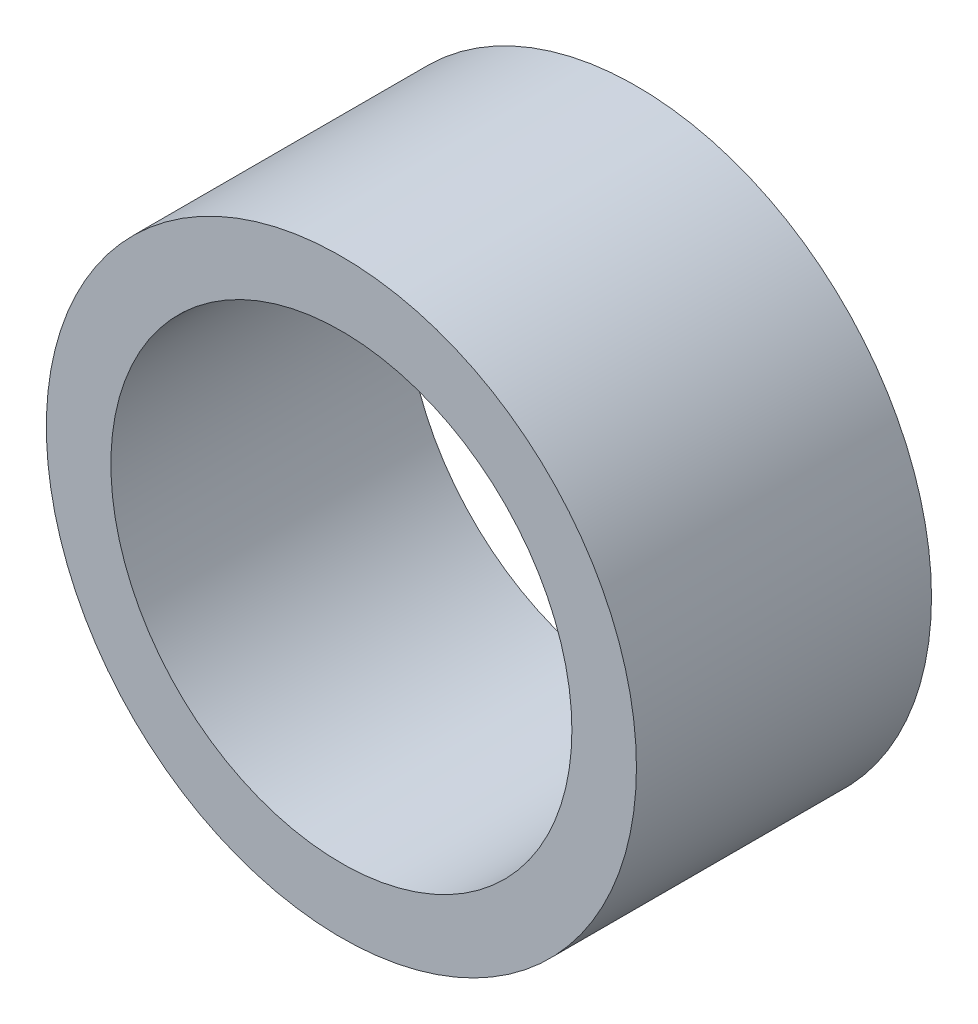
ISO-10303-21;
HEADER;
FILE_DESCRIPTION(('STEP AP214'),'2;1');
FILE_NAME('part.step','',(''),(''),'','','');
FILE_SCHEMA(('AUTOMOTIVE_DESIGN { 1 0 10303 214 1 1 1 1 }'));
ENDSEC;
DATA;
#1=APPLICATION_CONTEXT('core data for automotive mechanical design processes');
#2=APPLICATION_PROTOCOL_DEFINITION('international standard','automotive_design',2000,#1);
#3=PRODUCT_CONTEXT('',#1,'mechanical');
#4=PRODUCT('Part','Part','',(#3));
#5=PRODUCT_RELATED_PRODUCT_CATEGORY('part','',(#4));
#6=PRODUCT_DEFINITION_FORMATION('','',#4);
#7=PRODUCT_DEFINITION_CONTEXT('part definition',#1,'design');
#8=PRODUCT_DEFINITION('design','',#6,#7);
#9=PRODUCT_DEFINITION_SHAPE('','',#8);
#10=(LENGTH_UNIT() NAMED_UNIT(*) SI_UNIT(.MILLI.,.METRE.));
#11=(NAMED_UNIT(*) PLANE_ANGLE_UNIT() SI_UNIT($,.RADIAN.));
#12=(NAMED_UNIT(*) SI_UNIT($,.STERADIAN.) SOLID_ANGLE_UNIT());
#13=UNCERTAINTY_MEASURE_WITH_UNIT(LENGTH_MEASURE(1.E-05),#10,'distance_accuracy_value','');
#14=(GEOMETRIC_REPRESENTATION_CONTEXT(3) GLOBAL_UNCERTAINTY_ASSIGNED_CONTEXT((#13)) GLOBAL_UNIT_ASSIGNED_CONTEXT((#10,
#11,#12)) REPRESENTATION_CONTEXT('',''));
#15=CARTESIAN_POINT('',(0.,0.,0.));
#16=DIRECTION('',(0.,0.,1.));
#17=DIRECTION('',(1.,0.,0.));
#18=AXIS2_PLACEMENT_3D('',#15,#16,#17);
#19=CARTESIAN_POINT('',(0.,0.,16.));
#20=DIRECTION('',(0.,0.,1.));
#21=DIRECTION('',(1.,0.,0.));
#22=AXIS2_PLACEMENT_3D('',#19,#20,#21);
#23=PLANE('',#22);
#24=CARTESIAN_POINT('',(0.,0.,16.));
#25=DIRECTION('',(0.,0.,1.));
#26=DIRECTION('',(1.,0.,0.));
#27=AXIS2_PLACEMENT_3D('',#24,#25,#26);
#28=CIRCLE('',#27,16.);
#29=CARTESIAN_POINT('',(16.,0.,16.));
#30=VERTEX_POINT('',#29);
#31=EDGE_CURVE('E10',#30,#30,#28,.T.);
#32=ORIENTED_EDGE('',*,*,#31,.T.);
#33=EDGE_LOOP('',(#32));
#34=FACE_BOUND('',#33,.T.);
#35=CARTESIAN_POINT('',(0.,0.,16.));
#36=DIRECTION('',(0.,0.,1.));
#37=DIRECTION('',(1.,0.,0.));
#38=AXIS2_PLACEMENT_3D('',#35,#36,#37);
#39=CIRCLE('',#38,12.5);
#40=CARTESIAN_POINT('',(12.5,0.,16.));
#41=VERTEX_POINT('',#40);
#42=EDGE_CURVE('E42',#41,#41,#39,.T.);
#43=ORIENTED_EDGE('',*,*,#42,.F.);
#44=EDGE_LOOP('',(#43));
#45=FACE_BOUND('',#44,.T.);
#46=ADVANCED_FACE('F31',(#34,#45),#23,.T.);
#47=CARTESIAN_POINT('',(0.,0.,0.));
#48=DIRECTION('',(0.,0.,1.));
#49=DIRECTION('',(1.,0.,0.));
#50=AXIS2_PLACEMENT_3D('',#47,#48,#49);
#51=PLANE('',#50);
#52=CARTESIAN_POINT('',(0.,0.,0.));
#53=DIRECTION('',(0.,0.,1.));
#54=DIRECTION('',(1.,0.,0.));
#55=AXIS2_PLACEMENT_3D('',#52,#53,#54);
#56=CIRCLE('',#55,16.);
#57=CARTESIAN_POINT('',(16.,0.,0.));
#58=VERTEX_POINT('',#57);
#59=EDGE_CURVE('E35',#58,#58,#56,.T.);
#60=ORIENTED_EDGE('',*,*,#59,.F.);
#61=EDGE_LOOP('',(#60));
#62=FACE_BOUND('',#61,.T.);
#63=CARTESIAN_POINT('',(0.,0.,0.));
#64=DIRECTION('',(0.,0.,1.));
#65=DIRECTION('',(1.,0.,0.));
#66=AXIS2_PLACEMENT_3D('',#63,#64,#65);
#67=CIRCLE('',#66,12.5);
#68=CARTESIAN_POINT('',(12.5,0.,0.));
#69=VERTEX_POINT('',#68);
#70=EDGE_CURVE('E44',#69,#69,#67,.T.);
#71=ORIENTED_EDGE('',*,*,#70,.T.);
#72=EDGE_LOOP('',(#71));
#73=FACE_BOUND('',#72,.T.);
#74=ADVANCED_FACE('F54',(#62,#73),#51,.F.);
#75=CARTESIAN_POINT('',(0.,0.,16.));
#76=DIRECTION('',(0.,0.,-1.));
#77=DIRECTION('',(-1.,0.,0.));
#78=AXIS2_PLACEMENT_3D('',#75,#76,#77);
#79=CYLINDRICAL_SURFACE('',#78,16.);
#80=ORIENTED_EDGE('',*,*,#31,.F.);
#81=EDGE_LOOP('',(#80));
#82=FACE_BOUND('',#81,.T.);
#83=ORIENTED_EDGE('',*,*,#59,.T.);
#84=EDGE_LOOP('',(#83));
#85=FACE_BOUND('',#84,.T.);
#86=ADVANCED_FACE('F33',(#82,#85),#79,.T.);
#87=CARTESIAN_POINT('',(0.,0.,16.));
#88=DIRECTION('',(0.,0.,-1.));
#89=DIRECTION('',(-1.,0.,0.));
#90=AXIS2_PLACEMENT_3D('',#87,#88,#89);
#91=CYLINDRICAL_SURFACE('',#90,12.5);
#92=ORIENTED_EDGE('',*,*,#42,.T.);
#93=EDGE_LOOP('',(#92));
#94=FACE_BOUND('',#93,.T.);
#95=ORIENTED_EDGE('',*,*,#70,.F.);
#96=EDGE_LOOP('',(#95));
#97=FACE_BOUND('',#96,.T.);
#98=ADVANCED_FACE('F50',(#94,#97),#91,.F.);
#99=CLOSED_SHELL('',(#46,#74,#86,#98));
#100=MANIFOLD_SOLID_BREP('B2',#99);
#101=ADVANCED_BREP_SHAPE_REPRESENTATION('',(#18,#100),#14);
#102=SHAPE_DEFINITION_REPRESENTATION(#9,#101);
ENDSEC;
END-ISO-10303-21;
